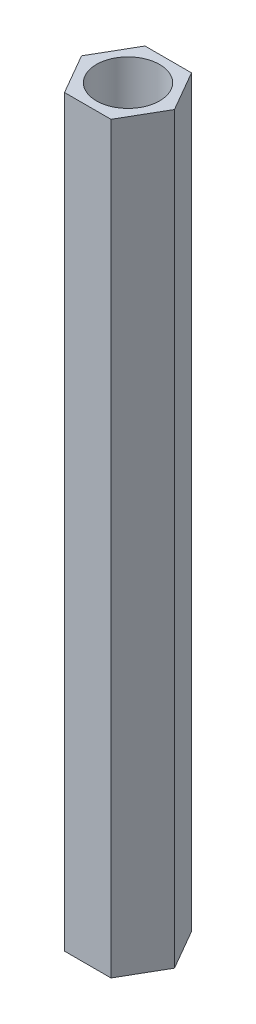
ISO-10303-21;
HEADER;
FILE_DESCRIPTION(('STEP AP214'),'2;1');
FILE_NAME('part.step','',(''),(''),'','','');
FILE_SCHEMA(('AUTOMOTIVE_DESIGN { 1 0 10303 214 1 1 1 1 }'));
ENDSEC;
DATA;
#1=APPLICATION_CONTEXT('core data for automotive mechanical design processes');
#2=APPLICATION_PROTOCOL_DEFINITION('international standard','automotive_design',2000,#1);
#3=PRODUCT_CONTEXT('',#1,'mechanical');
#4=PRODUCT('Part','Part','',(#3));
#5=PRODUCT_RELATED_PRODUCT_CATEGORY('part','',(#4));
#6=PRODUCT_DEFINITION_FORMATION('','',#4);
#7=PRODUCT_DEFINITION_CONTEXT('part definition',#1,'design');
#8=PRODUCT_DEFINITION('design','',#6,#7);
#9=PRODUCT_DEFINITION_SHAPE('','',#8);
#10=(LENGTH_UNIT() NAMED_UNIT(*) SI_UNIT(.MILLI.,.METRE.));
#11=(NAMED_UNIT(*) PLANE_ANGLE_UNIT() SI_UNIT($,.RADIAN.));
#12=(NAMED_UNIT(*) SI_UNIT($,.STERADIAN.) SOLID_ANGLE_UNIT());
#13=UNCERTAINTY_MEASURE_WITH_UNIT(LENGTH_MEASURE(1.E-05),#10,'distance_accuracy_value','');
#14=(GEOMETRIC_REPRESENTATION_CONTEXT(3) GLOBAL_UNCERTAINTY_ASSIGNED_CONTEXT((#13)) GLOBAL_UNIT_ASSIGNED_CONTEXT((#10,
#11,#12)) REPRESENTATION_CONTEXT('',''));
#15=CARTESIAN_POINT('',(0.,0.,0.));
#16=DIRECTION('',(0.,0.,1.));
#17=DIRECTION('',(1.,0.,0.));
#18=AXIS2_PLACEMENT_3D('',#15,#16,#17);
#19=CARTESIAN_POINT('',(1.25000000000002,40.,2.16506350946108));
#20=DIRECTION('',(-0.866025403784441,0.,-0.499999999999995));
#21=DIRECTION('',(-0.499999999999995,0.,0.866025403784441));
#22=AXIS2_PLACEMENT_3D('',#19,#20,#21);
#23=PLANE('',#22);
#24=DIRECTION('',(0.499999999999995,0.,-0.866025403784441));
#25=VECTOR('',#24,1.);
#26=CARTESIAN_POINT('',(1.25000000000002,0.,2.16506350946108));
#27=LINE('',#26,#25);
#28=CARTESIAN_POINT('',(1.25000000000002,0.,2.16506350946108));
#29=VERTEX_POINT('',#28);
#30=CARTESIAN_POINT('',(2.5,0.,0.));
#31=VERTEX_POINT('',#30);
#32=EDGE_CURVE('E124',#29,#31,#27,.T.);
#33=ORIENTED_EDGE('',*,*,#32,.T.);
#34=DIRECTION('',(0.,-1.,0.));
#35=VECTOR('',#34,1.);
#36=CARTESIAN_POINT('',(2.5,40.,0.));
#37=LINE('',#36,#35);
#38=CARTESIAN_POINT('',(2.5,40.,0.));
#39=VERTEX_POINT('',#38);
#40=EDGE_CURVE('E11',#39,#31,#37,.T.);
#41=ORIENTED_EDGE('',*,*,#40,.F.);
#42=DIRECTION('',(0.499999999999995,0.,-0.866025403784441));
#43=VECTOR('',#42,1.);
#44=CARTESIAN_POINT('',(1.25000000000002,40.,2.16506350946108));
#45=LINE('',#44,#43);
#46=CARTESIAN_POINT('',(1.25000000000002,40.,2.16506350946108));
#47=VERTEX_POINT('',#46);
#48=EDGE_CURVE('E134',#47,#39,#45,.T.);
#49=ORIENTED_EDGE('',*,*,#48,.F.);
#50=DIRECTION('',(0.,-1.,0.));
#51=VECTOR('',#50,1.);
#52=CARTESIAN_POINT('',(1.25000000000002,40.,2.16506350946108));
#53=LINE('',#52,#51);
#54=EDGE_CURVE('E120',#47,#29,#53,.T.);
#55=ORIENTED_EDGE('',*,*,#54,.T.);
#56=EDGE_LOOP('',(#33,#41,#49,#55));
#57=FACE_BOUND('',#56,.T.);
#58=ADVANCED_FACE('F39',(#57),#23,.F.);
#59=CARTESIAN_POINT('',(2.5,40.,0.));
#60=DIRECTION('',(-0.866025403784438,0.,0.500000000000001));
#61=DIRECTION('',(0.500000000000001,0.,0.866025403784438));
#62=AXIS2_PLACEMENT_3D('',#59,#60,#61);
#63=PLANE('',#62);
#64=DIRECTION('',(-0.500000000000001,0.,-0.866025403784438));
#65=VECTOR('',#64,1.);
#66=CARTESIAN_POINT('',(2.5,0.,0.));
#67=LINE('',#66,#65);
#68=CARTESIAN_POINT('',(1.24999999999999,0.,-2.1650635094611));
#69=VERTEX_POINT('',#68);
#70=EDGE_CURVE('E127',#31,#69,#67,.T.);
#71=ORIENTED_EDGE('',*,*,#70,.T.);
#72=DIRECTION('',(0.,-1.,0.));
#73=VECTOR('',#72,1.);
#74=CARTESIAN_POINT('',(1.24999999999999,40.,-2.1650635094611));
#75=LINE('',#74,#73);
#76=CARTESIAN_POINT('',(1.24999999999999,40.,-2.1650635094611));
#77=VERTEX_POINT('',#76);
#78=EDGE_CURVE('E48',#77,#69,#75,.T.);
#79=ORIENTED_EDGE('',*,*,#78,.F.);
#80=DIRECTION('',(-0.500000000000001,0.,-0.866025403784438));
#81=VECTOR('',#80,1.);
#82=CARTESIAN_POINT('',(2.5,40.,0.));
#83=LINE('',#82,#81);
#84=EDGE_CURVE('E93',#39,#77,#83,.T.);
#85=ORIENTED_EDGE('',*,*,#84,.F.);
#86=ORIENTED_EDGE('',*,*,#40,.T.);
#87=EDGE_LOOP('',(#71,#79,#85,#86));
#88=FACE_BOUND('',#87,.T.);
#89=ADVANCED_FACE('F160',(#88),#63,.F.);
#90=CARTESIAN_POINT('',(1.24999999999999,40.,-2.1650635094611));
#91=DIRECTION('',(0.,0.,1.));
#92=DIRECTION('',(1.,0.,0.));
#93=AXIS2_PLACEMENT_3D('',#90,#91,#92);
#94=PLANE('',#93);
#95=DIRECTION('',(-1.,0.,0.));
#96=VECTOR('',#95,1.);
#97=CARTESIAN_POINT('',(1.24999999999999,0.,-2.1650635094611));
#98=LINE('',#97,#96);
#99=CARTESIAN_POINT('',(-1.25000000000001,0.,-2.16506350946109));
#100=VERTEX_POINT('',#99);
#101=EDGE_CURVE('E129',#69,#100,#98,.T.);
#102=ORIENTED_EDGE('',*,*,#101,.T.);
#103=DIRECTION('',(0.,-1.,0.));
#104=VECTOR('',#103,1.);
#105=CARTESIAN_POINT('',(-1.25000000000001,40.,-2.16506350946109));
#106=LINE('',#105,#104);
#107=CARTESIAN_POINT('',(-1.25000000000001,40.,-2.16506350946109));
#108=VERTEX_POINT('',#107);
#109=EDGE_CURVE('E115',#108,#100,#106,.T.);
#110=ORIENTED_EDGE('',*,*,#109,.F.);
#111=DIRECTION('',(-1.,0.,0.));
#112=VECTOR('',#111,1.);
#113=CARTESIAN_POINT('',(1.24999999999999,40.,-2.1650635094611));
#114=LINE('',#113,#112);
#115=EDGE_CURVE('E106',#77,#108,#114,.T.);
#116=ORIENTED_EDGE('',*,*,#115,.F.);
#117=ORIENTED_EDGE('',*,*,#78,.T.);
#118=EDGE_LOOP('',(#102,#110,#116,#117));
#119=FACE_BOUND('',#118,.T.);
#120=ADVANCED_FACE('F141',(#119),#94,.F.);
#121=CARTESIAN_POINT('',(-1.25000000000001,40.,-2.16506350946109));
#122=DIRECTION('',(0.866025403784442,0.,0.499999999999995));
#123=DIRECTION('',(0.499999999999995,0.,-0.866025403784442));
#124=AXIS2_PLACEMENT_3D('',#121,#122,#123);
#125=PLANE('',#124);
#126=DIRECTION('',(-0.499999999999995,0.,0.866025403784442));
#127=VECTOR('',#126,1.);
#128=CARTESIAN_POINT('',(-1.25000000000001,0.,-2.16506350946109));
#129=LINE('',#128,#127);
#130=CARTESIAN_POINT('',(-2.5,0.,0.));
#131=VERTEX_POINT('',#130);
#132=EDGE_CURVE('E114',#100,#131,#129,.T.);
#133=ORIENTED_EDGE('',*,*,#132,.T.);
#134=DIRECTION('',(0.,-1.,0.));
#135=VECTOR('',#134,1.);
#136=CARTESIAN_POINT('',(-2.5,40.,0.));
#137=LINE('',#136,#135);
#138=CARTESIAN_POINT('',(-2.5,40.,0.));
#139=VERTEX_POINT('',#138);
#140=EDGE_CURVE('E111',#139,#131,#137,.T.);
#141=ORIENTED_EDGE('',*,*,#140,.F.);
#142=DIRECTION('',(-0.499999999999995,0.,0.866025403784442));
#143=VECTOR('',#142,1.);
#144=CARTESIAN_POINT('',(-1.25000000000001,40.,-2.16506350946109));
#145=LINE('',#144,#143);
#146=EDGE_CURVE('E100',#108,#139,#145,.T.);
#147=ORIENTED_EDGE('',*,*,#146,.F.);
#148=ORIENTED_EDGE('',*,*,#109,.T.);
#149=EDGE_LOOP('',(#133,#141,#147,#148));
#150=FACE_BOUND('',#149,.T.);
#151=ADVANCED_FACE('F112',(#150),#125,.F.);
#152=CARTESIAN_POINT('',(-2.5,40.,0.));
#153=DIRECTION('',(0.866025403784434,0.,-0.500000000000007));
#154=DIRECTION('',(-0.500000000000007,0.,-0.866025403784435));
#155=AXIS2_PLACEMENT_3D('',#152,#153,#154);
#156=PLANE('',#155);
#157=DIRECTION('',(0.500000000000007,0.,0.866025403784434));
#158=VECTOR('',#157,1.);
#159=CARTESIAN_POINT('',(-2.5,0.,0.));
#160=LINE('',#159,#158);
#161=CARTESIAN_POINT('',(-1.24999999999998,0.,2.1650635094611));
#162=VERTEX_POINT('',#161);
#163=EDGE_CURVE('E79',#131,#162,#160,.T.);
#164=ORIENTED_EDGE('',*,*,#163,.T.);
#165=DIRECTION('',(0.,-1.,0.));
#166=VECTOR('',#165,1.);
#167=CARTESIAN_POINT('',(-1.24999999999998,40.,2.1650635094611));
#168=LINE('',#167,#166);
#169=CARTESIAN_POINT('',(-1.24999999999998,40.,2.1650635094611));
#170=VERTEX_POINT('',#169);
#171=EDGE_CURVE('E116',#170,#162,#168,.T.);
#172=ORIENTED_EDGE('',*,*,#171,.F.);
#173=DIRECTION('',(0.500000000000007,0.,0.866025403784434));
#174=VECTOR('',#173,1.);
#175=CARTESIAN_POINT('',(-2.5,40.,0.));
#176=LINE('',#175,#174);
#177=EDGE_CURVE('E104',#139,#170,#176,.T.);
#178=ORIENTED_EDGE('',*,*,#177,.F.);
#179=ORIENTED_EDGE('',*,*,#140,.T.);
#180=EDGE_LOOP('',(#164,#172,#178,#179));
#181=FACE_BOUND('',#180,.T.);
#182=ADVANCED_FACE('F118',(#181),#156,.F.);
#183=CARTESIAN_POINT('',(-1.24999999999998,40.,2.1650635094611));
#184=DIRECTION('',(0.,0.,-1.));
#185=DIRECTION('',(-1.,0.,0.));
#186=AXIS2_PLACEMENT_3D('',#183,#184,#185);
#187=PLANE('',#186);
#188=DIRECTION('',(1.,0.,0.));
#189=VECTOR('',#188,1.);
#190=CARTESIAN_POINT('',(-1.24999999999998,0.,2.1650635094611));
#191=LINE('',#190,#189);
#192=EDGE_CURVE('E85',#162,#29,#191,.T.);
#193=ORIENTED_EDGE('',*,*,#192,.T.);
#194=ORIENTED_EDGE('',*,*,#54,.F.);
#195=DIRECTION('',(1.,0.,0.));
#196=VECTOR('',#195,1.);
#197=CARTESIAN_POINT('',(-1.24999999999998,40.,2.1650635094611));
#198=LINE('',#197,#196);
#199=EDGE_CURVE('E56',#170,#47,#198,.T.);
#200=ORIENTED_EDGE('',*,*,#199,.F.);
#201=ORIENTED_EDGE('',*,*,#171,.T.);
#202=EDGE_LOOP('',(#193,#194,#200,#201));
#203=FACE_BOUND('',#202,.T.);
#204=ADVANCED_FACE('F148',(#203),#187,.F.);
#205=CARTESIAN_POINT('',(0.,40.,0.));
#206=DIRECTION('',(0.,1.,0.));
#207=DIRECTION('',(0.,0.,1.));
#208=AXIS2_PLACEMENT_3D('',#205,#206,#207);
#209=PLANE('',#208);
#210=CARTESIAN_POINT('',(0.,40.,0.));
#211=DIRECTION('',(0.,1.,0.));
#212=DIRECTION('',(0.,0.,1.));
#213=AXIS2_PLACEMENT_3D('',#210,#211,#212);
#214=CIRCLE('',#213,1.7);
#215=CARTESIAN_POINT('',(0.,40.,1.7));
#216=VERTEX_POINT('',#215);
#217=EDGE_CURVE('E214',#216,#216,#214,.T.);
#218=ORIENTED_EDGE('',*,*,#217,.F.);
#219=EDGE_LOOP('',(#218));
#220=FACE_BOUND('',#219,.T.);
#221=ORIENTED_EDGE('',*,*,#48,.T.);
#222=ORIENTED_EDGE('',*,*,#84,.T.);
#223=ORIENTED_EDGE('',*,*,#115,.T.);
#224=ORIENTED_EDGE('',*,*,#146,.T.);
#225=ORIENTED_EDGE('',*,*,#177,.T.);
#226=ORIENTED_EDGE('',*,*,#199,.T.);
#227=EDGE_LOOP('',(#221,#222,#223,#224,#225,#226));
#228=FACE_BOUND('',#227,.T.);
#229=ADVANCED_FACE('F102',(#220,#228),#209,.T.);
#230=CARTESIAN_POINT('',(0.,0.,0.));
#231=DIRECTION('',(0.,1.,0.));
#232=DIRECTION('',(0.,0.,1.));
#233=AXIS2_PLACEMENT_3D('',#230,#231,#232);
#234=PLANE('',#233);
#235=CARTESIAN_POINT('',(0.,0.,0.));
#236=DIRECTION('',(0.,1.,0.));
#237=DIRECTION('',(0.,0.,1.));
#238=AXIS2_PLACEMENT_3D('',#235,#236,#237);
#239=CIRCLE('',#238,1.7);
#240=CARTESIAN_POINT('',(0.,0.,1.7));
#241=VERTEX_POINT('',#240);
#242=EDGE_CURVE('E42',#241,#241,#239,.T.);
#243=ORIENTED_EDGE('',*,*,#242,.T.);
#244=EDGE_LOOP('',(#243));
#245=FACE_BOUND('',#244,.T.);
#246=ORIENTED_EDGE('',*,*,#32,.F.);
#247=ORIENTED_EDGE('',*,*,#192,.F.);
#248=ORIENTED_EDGE('',*,*,#163,.F.);
#249=ORIENTED_EDGE('',*,*,#132,.F.);
#250=ORIENTED_EDGE('',*,*,#101,.F.);
#251=ORIENTED_EDGE('',*,*,#70,.F.);
#252=EDGE_LOOP('',(#246,#247,#248,#249,#250,#251));
#253=FACE_BOUND('',#252,.T.);
#254=ADVANCED_FACE('F144',(#245,#253),#234,.F.);
#255=CARTESIAN_POINT('',(0.,-4.00000000000001,0.));
#256=DIRECTION('',(0.,1.,0.));
#257=DIRECTION('',(0.,0.,1.));
#258=AXIS2_PLACEMENT_3D('',#255,#256,#257);
#259=CYLINDRICAL_SURFACE('',#258,1.7);
#260=ORIENTED_EDGE('',*,*,#217,.T.);
#261=EDGE_LOOP('',(#260));
#262=FACE_BOUND('',#261,.T.);
#263=ORIENTED_EDGE('',*,*,#242,.F.);
#264=EDGE_LOOP('',(#263));
#265=FACE_BOUND('',#264,.T.);
#266=ADVANCED_FACE('F199',(#262,#265),#259,.F.);
#267=CLOSED_SHELL('',(#58,#89,#120,#151,#182,#204,#229,#254,#266));
#268=MANIFOLD_SOLID_BREP('B2',#267);
#269=ADVANCED_BREP_SHAPE_REPRESENTATION('',(#18,#268),#14);
#270=SHAPE_DEFINITION_REPRESENTATION(#9,#269);
ENDSEC;
END-ISO-10303-21;
